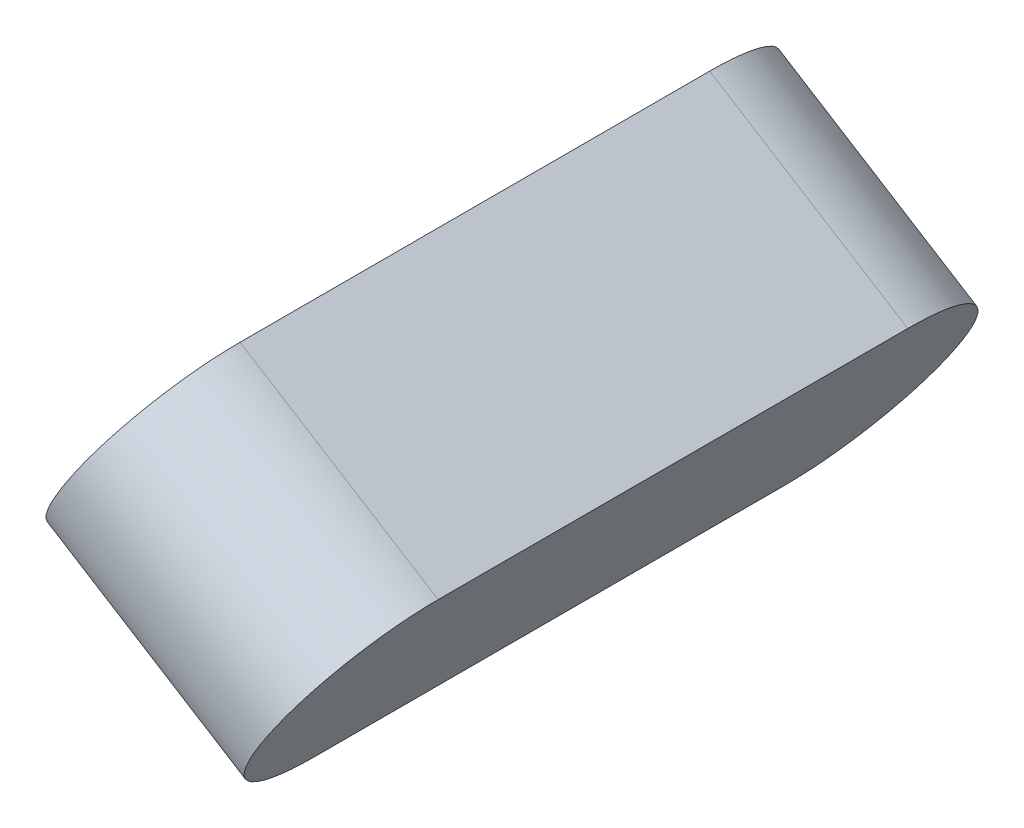
ISO-10303-21;
HEADER;
FILE_DESCRIPTION(('STEP AP214'),'2;1');
FILE_NAME('part.step','',(''),(''),'','','');
FILE_SCHEMA(('AUTOMOTIVE_DESIGN { 1 0 10303 214 1 1 1 1 }'));
ENDSEC;
DATA;
#1=APPLICATION_CONTEXT('core data for automotive mechanical design processes');
#2=APPLICATION_PROTOCOL_DEFINITION('international standard','automotive_design',2000,#1);
#3=PRODUCT_CONTEXT('',#1,'mechanical');
#4=PRODUCT('Part','Part','',(#3));
#5=PRODUCT_RELATED_PRODUCT_CATEGORY('part','',(#4));
#6=PRODUCT_DEFINITION_FORMATION('','',#4);
#7=PRODUCT_DEFINITION_CONTEXT('part definition',#1,'design');
#8=PRODUCT_DEFINITION('design','',#6,#7);
#9=PRODUCT_DEFINITION_SHAPE('','',#8);
#10=(LENGTH_UNIT() NAMED_UNIT(*) SI_UNIT(.MILLI.,.METRE.));
#11=(NAMED_UNIT(*) PLANE_ANGLE_UNIT() SI_UNIT($,.RADIAN.));
#12=(NAMED_UNIT(*) SI_UNIT($,.STERADIAN.) SOLID_ANGLE_UNIT());
#13=UNCERTAINTY_MEASURE_WITH_UNIT(LENGTH_MEASURE(1.E-05),#10,'distance_accuracy_value','');
#14=(GEOMETRIC_REPRESENTATION_CONTEXT(3) GLOBAL_UNCERTAINTY_ASSIGNED_CONTEXT((#13)) GLOBAL_UNIT_ASSIGNED_CONTEXT((#10,
#11,#12)) REPRESENTATION_CONTEXT('',''));
#15=CARTESIAN_POINT('',(0.,0.,0.));
#16=DIRECTION('',(0.,0.,1.));
#17=DIRECTION('',(1.,0.,0.));
#18=AXIS2_PLACEMENT_3D('',#15,#16,#17);
#19=CARTESIAN_POINT('',(-48.0109204316982,20.0113673356175,-155.));
#20=DIRECTION('',(-0.847998304002868,0.529998940006732,0.));
#21=DIRECTION('',(-0.529998940006732,-0.847998304002868,0.));
#22=AXIS2_PLACEMENT_3D('',#19,#20,#21);
#23=CYLINDRICAL_SURFACE('',#22,10.);
#24=CARTESIAN_POINT('',(-64.9708865117555,30.6113461357521,-155.));
#25=DIRECTION('',(-0.847998304002868,0.529998940006732,0.));
#26=DIRECTION('',(-0.529998940006732,-0.847998304002868,0.));
#27=AXIS2_PLACEMENT_3D('',#24,#25,#26);
#28=CIRCLE('',#27,10.);
#29=CARTESIAN_POINT('',(-59.6708971116882,39.0913291757808,-155.));
#30=VERTEX_POINT('',#29);
#31=CARTESIAN_POINT('',(-70.2708759118229,22.1313630957235,-155.));
#32=VERTEX_POINT('',#31);
#33=EDGE_CURVE('E115',#30,#32,#28,.T.);
#34=ORIENTED_EDGE('',*,*,#33,.F.);
#35=DIRECTION('',(-0.847998304002868,0.529998940006732,0.));
#36=VECTOR('',#35,1.);
#37=CARTESIAN_POINT('',(-42.7109310316308,28.4913503756462,-155.));
#38=LINE('',#37,#36);
#39=CARTESIAN_POINT('',(-42.7109310316308,28.4913503756462,-155.));
#40=VERTEX_POINT('',#39);
#41=EDGE_CURVE('E11',#40,#30,#38,.T.);
#42=ORIENTED_EDGE('',*,*,#41,.F.);
#43=CARTESIAN_POINT('',(-48.0109204316982,20.0113673356175,-155.));
#44=DIRECTION('',(-0.847998304002868,0.529998940006732,0.));
#45=DIRECTION('',(-0.529998940006732,-0.847998304002868,0.));
#46=AXIS2_PLACEMENT_3D('',#43,#44,#45);
#47=CIRCLE('',#46,10.);
#48=CARTESIAN_POINT('',(-53.3109098317655,11.5313842955888,-155.));
#49=VERTEX_POINT('',#48);
#50=EDGE_CURVE('E106',#40,#49,#47,.T.);
#51=ORIENTED_EDGE('',*,*,#50,.T.);
#52=DIRECTION('',(-0.847998304002868,0.529998940006732,0.));
#53=VECTOR('',#52,1.);
#54=CARTESIAN_POINT('',(-53.3109098317655,11.5313842955888,-155.));
#55=LINE('',#54,#53);
#56=EDGE_CURVE('E46',#49,#32,#55,.T.);
#57=ORIENTED_EDGE('',*,*,#56,.T.);
#58=EDGE_LOOP('',(#34,#42,#51,#57));
#59=FACE_BOUND('',#58,.T.);
#60=ADVANCED_FACE('F43',(#59),#23,.T.);
#61=CARTESIAN_POINT('',(-42.7109310316308,28.4913503756462,0.));
#62=DIRECTION('',(-0.529998940006732,-0.847998304002868,0.));
#63=DIRECTION('',(0.847998304002868,-0.529998940006732,0.));
#64=AXIS2_PLACEMENT_3D('',#61,#62,#63);
#65=PLANE('',#64);
#66=DIRECTION('',(0.,0.,1.));
#67=VECTOR('',#66,1.);
#68=CARTESIAN_POINT('',(-59.6708971116882,39.0913291757808,0.));
#69=LINE('',#68,#67);
#70=CARTESIAN_POINT('',(-59.6708971116882,39.0913291757808,-114.798616700194));
#71=VERTEX_POINT('',#70);
#72=EDGE_CURVE('E111',#30,#71,#69,.T.);
#73=ORIENTED_EDGE('',*,*,#72,.T.);
#74=DIRECTION('',(-0.847998304002868,0.529998940006732,0.));
#75=VECTOR('',#74,1.);
#76=CARTESIAN_POINT('',(-42.7109310316308,28.4913503756462,-114.798616700194));
#77=LINE('',#76,#75);
#78=CARTESIAN_POINT('',(-42.7109310316308,28.4913503756462,-114.798616700194));
#79=VERTEX_POINT('',#78);
#80=EDGE_CURVE('E53',#79,#71,#77,.T.);
#81=ORIENTED_EDGE('',*,*,#80,.F.);
#82=DIRECTION('',(0.,0.,1.));
#83=VECTOR('',#82,1.);
#84=CARTESIAN_POINT('',(-42.7109310316308,28.4913503756462,0.));
#85=LINE('',#84,#83);
#86=EDGE_CURVE('E101',#40,#79,#85,.T.);
#87=ORIENTED_EDGE('',*,*,#86,.F.);
#88=ORIENTED_EDGE('',*,*,#41,.T.);
#89=EDGE_LOOP('',(#73,#81,#87,#88));
#90=FACE_BOUND('',#89,.T.);
#91=ADVANCED_FACE('F126',(#90),#65,.F.);
#92=CARTESIAN_POINT('',(-48.0109204316982,20.0113673356175,-114.798616700194));
#93=DIRECTION('',(-0.847998304002868,0.529998940006732,0.));
#94=DIRECTION('',(-0.529998940006732,-0.847998304002868,0.));
#95=AXIS2_PLACEMENT_3D('',#92,#93,#94);
#96=CYLINDRICAL_SURFACE('',#95,10.);
#97=CARTESIAN_POINT('',(-64.9708865117555,30.6113461357521,-114.798616700194));
#98=DIRECTION('',(-0.847998304002868,0.529998940006732,0.));
#99=DIRECTION('',(-0.529998940006732,-0.847998304002868,0.));
#100=AXIS2_PLACEMENT_3D('',#97,#98,#99);
#101=CIRCLE('',#100,10.);
#102=CARTESIAN_POINT('',(-70.2708759118229,22.1313630957235,-114.798616700194));
#103=VERTEX_POINT('',#102);
#104=EDGE_CURVE('E94',#103,#71,#101,.T.);
#105=ORIENTED_EDGE('',*,*,#104,.F.);
#106=DIRECTION('',(-0.847998304002868,0.529998940006732,0.));
#107=VECTOR('',#106,1.);
#108=CARTESIAN_POINT('',(-53.3109098317655,11.5313842955888,-114.798616700194));
#109=LINE('',#108,#107);
#110=CARTESIAN_POINT('',(-53.3109098317655,11.5313842955888,-114.798616700194));
#111=VERTEX_POINT('',#110);
#112=EDGE_CURVE('E89',#111,#103,#109,.T.);
#113=ORIENTED_EDGE('',*,*,#112,.F.);
#114=CARTESIAN_POINT('',(-48.0109204316982,20.0113673356175,-114.798616700194));
#115=DIRECTION('',(-0.847998304002868,0.529998940006732,0.));
#116=DIRECTION('',(-0.529998940006732,-0.847998304002868,0.));
#117=AXIS2_PLACEMENT_3D('',#114,#115,#116);
#118=CIRCLE('',#117,10.);
#119=EDGE_CURVE('E92',#111,#79,#118,.T.);
#120=ORIENTED_EDGE('',*,*,#119,.T.);
#121=ORIENTED_EDGE('',*,*,#80,.T.);
#122=EDGE_LOOP('',(#105,#113,#120,#121));
#123=FACE_BOUND('',#122,.T.);
#124=ADVANCED_FACE('F91',(#123),#96,.T.);
#125=CARTESIAN_POINT('',(-53.3109098317654,11.5313842955888,0.));
#126=DIRECTION('',(-0.529998940006732,-0.847998304002868,0.));
#127=DIRECTION('',(0.847998304002868,-0.529998940006732,0.));
#128=AXIS2_PLACEMENT_3D('',#125,#126,#127);
#129=PLANE('',#128);
#130=DIRECTION('',(0.,0.,1.));
#131=VECTOR('',#130,1.);
#132=CARTESIAN_POINT('',(-70.2708759118228,22.1313630957234,0.));
#133=LINE('',#132,#131);
#134=EDGE_CURVE('E119',#32,#103,#133,.T.);
#135=ORIENTED_EDGE('',*,*,#134,.F.);
#136=ORIENTED_EDGE('',*,*,#56,.F.);
#137=DIRECTION('',(0.,0.,1.));
#138=VECTOR('',#137,1.);
#139=CARTESIAN_POINT('',(-53.3109098317654,11.5313842955888,0.));
#140=LINE('',#139,#138);
#141=EDGE_CURVE('E100',#49,#111,#140,.T.);
#142=ORIENTED_EDGE('',*,*,#141,.T.);
#143=ORIENTED_EDGE('',*,*,#112,.T.);
#144=EDGE_LOOP('',(#135,#136,#142,#143));
#145=FACE_BOUND('',#144,.T.);
#146=ADVANCED_FACE('F104',(#145),#129,.T.);
#147=CARTESIAN_POINT('',(-43.5185797869726,27.1991123671113,0.));
#148=DIRECTION('',(-0.847998304002868,0.529998940006732,0.));
#149=DIRECTION('',(-0.529998940006732,-0.847998304002868,0.));
#150=AXIS2_PLACEMENT_3D('',#147,#148,#149);
#151=PLANE('',#150);
#152=ORIENTED_EDGE('',*,*,#50,.F.);
#153=ORIENTED_EDGE('',*,*,#86,.T.);
#154=ORIENTED_EDGE('',*,*,#119,.F.);
#155=ORIENTED_EDGE('',*,*,#141,.F.);
#156=EDGE_LOOP('',(#152,#153,#154,#155));
#157=FACE_BOUND('',#156,.T.);
#158=ADVANCED_FACE('F99',(#157),#151,.F.);
#159=CARTESIAN_POINT('',(-60.47854586703,37.799091167246,0.));
#160=DIRECTION('',(-0.847998304002868,0.529998940006732,0.));
#161=DIRECTION('',(-0.529998940006732,-0.847998304002868,0.));
#162=AXIS2_PLACEMENT_3D('',#159,#160,#161);
#163=PLANE('',#162);
#164=ORIENTED_EDGE('',*,*,#33,.T.);
#165=ORIENTED_EDGE('',*,*,#134,.T.);
#166=ORIENTED_EDGE('',*,*,#104,.T.);
#167=ORIENTED_EDGE('',*,*,#72,.F.);
#168=EDGE_LOOP('',(#164,#165,#166,#167));
#169=FACE_BOUND('',#168,.T.);
#170=ADVANCED_FACE('F128',(#169),#163,.T.);
#171=CLOSED_SHELL('',(#60,#91,#124,#146,#158,#170));
#172=MANIFOLD_SOLID_BREP('B2',#171);
#173=ADVANCED_BREP_SHAPE_REPRESENTATION('',(#18,#172),#14);
#174=SHAPE_DEFINITION_REPRESENTATION(#9,#173);
ENDSEC;
END-ISO-10303-21;
